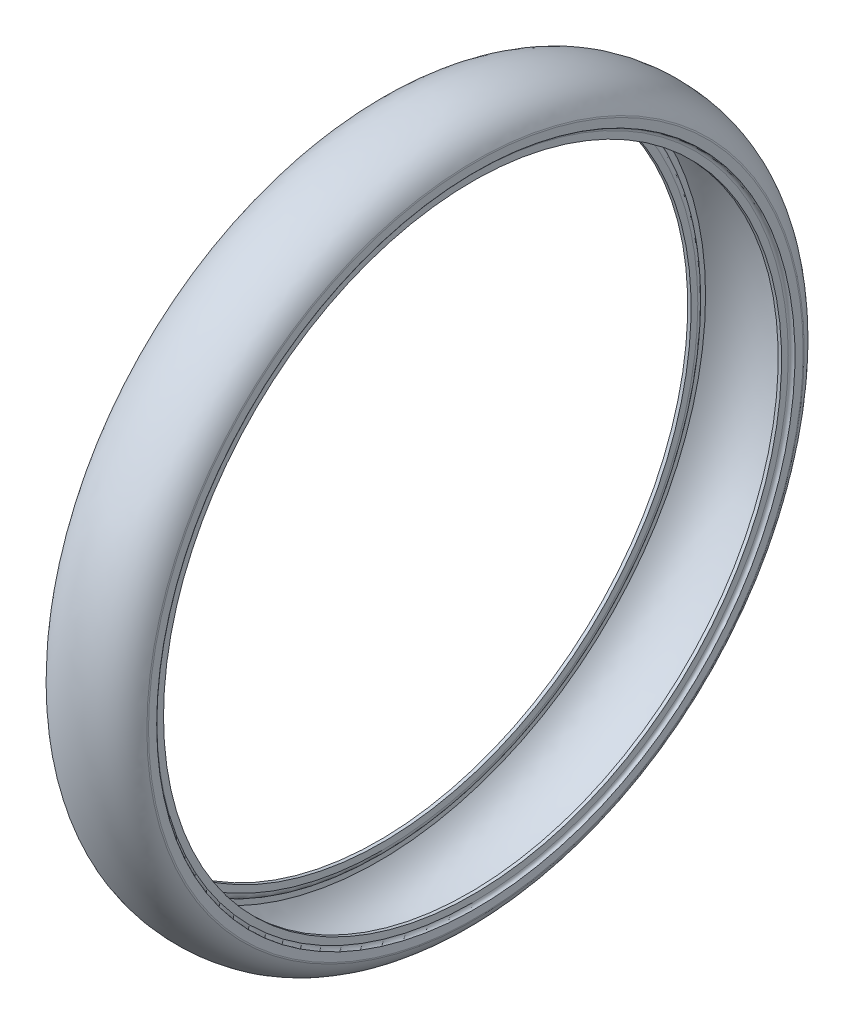
ISO-10303-21;
HEADER;
FILE_DESCRIPTION(('STEP AP214'),'2;1');
FILE_NAME('part.step','',(''),(''),'','','');
FILE_SCHEMA(('AUTOMOTIVE_DESIGN { 1 0 10303 214 1 1 1 1 }'));
ENDSEC;
DATA;
#1=APPLICATION_CONTEXT('core data for automotive mechanical design processes');
#2=APPLICATION_PROTOCOL_DEFINITION('international standard','automotive_design',2000,#1);
#3=PRODUCT_CONTEXT('',#1,'mechanical');
#4=PRODUCT('Part','Part','',(#3));
#5=PRODUCT_RELATED_PRODUCT_CATEGORY('part','',(#4));
#6=PRODUCT_DEFINITION_FORMATION('','',#4);
#7=PRODUCT_DEFINITION_CONTEXT('part definition',#1,'design');
#8=PRODUCT_DEFINITION('design','',#6,#7);
#9=PRODUCT_DEFINITION_SHAPE('','',#8);
#10=(LENGTH_UNIT() NAMED_UNIT(*) SI_UNIT(.MILLI.,.METRE.));
#11=(NAMED_UNIT(*) PLANE_ANGLE_UNIT() SI_UNIT($,.RADIAN.));
#12=(NAMED_UNIT(*) SI_UNIT($,.STERADIAN.) SOLID_ANGLE_UNIT());
#13=UNCERTAINTY_MEASURE_WITH_UNIT(LENGTH_MEASURE(1.E-05),#10,'distance_accuracy_value','');
#14=(GEOMETRIC_REPRESENTATION_CONTEXT(3) GLOBAL_UNCERTAINTY_ASSIGNED_CONTEXT((#13)) GLOBAL_UNIT_ASSIGNED_CONTEXT((#10,
#11,#12)) REPRESENTATION_CONTEXT('',''));
#15=CARTESIAN_POINT('',(0.,0.,0.));
#16=DIRECTION('',(0.,0.,1.));
#17=DIRECTION('',(1.,0.,0.));
#18=AXIS2_PLACEMENT_3D('',#15,#16,#17);
#19=CARTESIAN_POINT('',(-69.7003218060119,0.,0.));
#20=DIRECTION('',(-1.,0.,0.));
#21=DIRECTION('',(0.,0.,1.));
#22=AXIS2_PLACEMENT_3D('',#19,#20,#21);
#23=CYLINDRICAL_SURFACE('',#22,190.453309168517);
#24=CARTESIAN_POINT('',(29.9221511893584,0.,0.));
#25=DIRECTION('',(-1.,0.,0.));
#26=DIRECTION('',(0.,0.,1.));
#27=AXIS2_PLACEMENT_3D('',#24,#25,#26);
#28=CIRCLE('',#27,190.453309168517);
#29=CARTESIAN_POINT('',(29.9221511893584,0.,190.453309168517));
#30=VERTEX_POINT('',#29);
#31=EDGE_CURVE('E10',#30,#30,#28,.T.);
#32=ORIENTED_EDGE('',*,*,#31,.F.);
#33=EDGE_LOOP('',(#32));
#34=FACE_BOUND('',#33,.T.);
#35=CARTESIAN_POINT('',(29.9973296976846,0.,0.));
#36=DIRECTION('',(-1.,0.,0.));
#37=DIRECTION('',(0.,0.,1.));
#38=AXIS2_PLACEMENT_3D('',#35,#36,#37);
#39=CIRCLE('',#38,190.453309168517);
#40=CARTESIAN_POINT('',(29.9973296976846,0.,190.453309168517));
#41=VERTEX_POINT('',#40);
#42=EDGE_CURVE('E97',#41,#41,#39,.T.);
#43=ORIENTED_EDGE('',*,*,#42,.T.);
#44=EDGE_LOOP('',(#43));
#45=FACE_BOUND('',#44,.T.);
#46=ADVANCED_FACE('F33',(#34,#45),#23,.T.);
#47=CARTESIAN_POINT('',(29.9221511893584,0.,0.));
#48=DIRECTION('',(1.,0.,0.));
#49=DIRECTION('',(0.,0.,-1.));
#50=AXIS2_PLACEMENT_3D('',#47,#48,#49);
#51=CONICAL_SURFACE('',#50,190.453309168517,1.56326504380723);
#52=CARTESIAN_POINT('',(29.9592376138256,0.,0.));
#53=DIRECTION('',(-1.,0.,0.));
#54=DIRECTION('',(0.,0.,1.));
#55=AXIS2_PLACEMENT_3D('',#52,#53,#54);
#56=CIRCLE('',#55,195.377533014812);
#57=CARTESIAN_POINT('',(29.9592376138256,0.,195.377533014812));
#58=VERTEX_POINT('',#57);
#59=EDGE_CURVE('E39',#58,#58,#56,.T.);
#60=ORIENTED_EDGE('',*,*,#59,.F.);
#61=EDGE_LOOP('',(#60));
#62=FACE_BOUND('',#61,.T.);
#63=ORIENTED_EDGE('',*,*,#31,.T.);
#64=EDGE_LOOP('',(#63));
#65=FACE_BOUND('',#64,.T.);
#66=ADVANCED_FACE('F160',(#62,#65),#51,.F.);
#67=CARTESIAN_POINT('',(27.9592943337809,0.,0.));
#68=DIRECTION('',(-1.,0.,0.));
#69=DIRECTION('',(0.,0.,1.));
#70=AXIS2_PLACEMENT_3D('',#67,#68,#69);
#71=TOROIDAL_SURFACE('',#70,195.392595438395,2.);
#72=CARTESIAN_POINT('',(29.7951588128677,0.,0.));
#73=DIRECTION('',(-1.,0.,0.));
#74=DIRECTION('',(0.,0.,1.));
#75=AXIS2_PLACEMENT_3D('',#72,#73,#74);
#76=CIRCLE('',#75,196.186069832706);
#77=CARTESIAN_POINT('',(29.7951588128677,0.,196.186069832706));
#78=VERTEX_POINT('',#77);
#79=EDGE_CURVE('E43',#78,#78,#76,.T.);
#80=ORIENTED_EDGE('',*,*,#79,.F.);
#81=EDGE_LOOP('',(#80));
#82=FACE_BOUND('',#81,.T.);
#83=ORIENTED_EDGE('',*,*,#59,.T.);
#84=EDGE_LOOP('',(#83));
#85=FACE_BOUND('',#84,.T.);
#86=ADVANCED_FACE('F157',(#82,#85),#71,.T.);
#87=CARTESIAN_POINT('',(29.7951588128678,196.186069832706,0.));
#88=CARTESIAN_POINT('',(24.6514982379357,208.086975280572,0.));
#89=CARTESIAN_POINT('',(-1.31981855837392,214.356733350278,0.));
#90=CARTESIAN_POINT('',(-21.5303275099972,207.553282450587,0.));
#91=CARTESIAN_POINT('',(-29.5569901405227,196.163244360254,0.));
#92=B_SPLINE_CURVE_WITH_KNOTS('',3,(#87,#88,#89,#90,#91),.UNSPECIFIED.,.F.,.F.,(4,1,4),
(0.00865375810494037,0.498923348823319,0.989683095372889),.UNSPECIFIED.);
#93=CARTESIAN_POINT('',(-69.7003218060119,0.,0.));
#94=DIRECTION('',(-1.,0.,0.));
#95=AXIS1_PLACEMENT('',#93,#94);
#96=SURFACE_OF_REVOLUTION('',#92,#95);
#97=CARTESIAN_POINT('',(-29.5569901405227,0.,0.));
#98=DIRECTION('',(-1.,0.,0.));
#99=DIRECTION('',(0.,0.,1.));
#100=AXIS2_PLACEMENT_3D('',#97,#98,#99);
#101=CIRCLE('',#100,196.163244360254);
#102=CARTESIAN_POINT('',(-29.5569901405227,0.,196.163244360254));
#103=VERTEX_POINT('',#102);
#104=EDGE_CURVE('E47',#103,#103,#101,.T.);
#105=ORIENTED_EDGE('',*,*,#104,.F.);
#106=EDGE_LOOP('',(#105));
#107=FACE_BOUND('',#106,.T.);
#108=ORIENTED_EDGE('',*,*,#79,.T.);
#109=EDGE_LOOP('',(#108));
#110=FACE_BOUND('',#109,.T.);
#111=ADVANCED_FACE('F153',(#107,#110),#96,.T.);
#112=CARTESIAN_POINT('',(-27.9221511893584,0.,0.));
#113=DIRECTION('',(-1.,0.,0.));
#114=DIRECTION('',(0.,0.,1.));
#115=AXIS2_PLACEMENT_3D('',#112,#113,#114);
#116=TOROIDAL_SURFACE('',#115,195.011158597928,1.99999999999999);
#117=CARTESIAN_POINT('',(-29.9221511893584,0.,0.));
#118=DIRECTION('',(-1.,0.,0.));
#119=DIRECTION('',(0.,0.,1.));
#120=AXIS2_PLACEMENT_3D('',#117,#118,#119);
#121=CIRCLE('',#120,195.011158597928);
#122=CARTESIAN_POINT('',(-29.9221511893584,0.,195.011158597928));
#123=VERTEX_POINT('',#122);
#124=EDGE_CURVE('E52',#123,#123,#121,.T.);
#125=ORIENTED_EDGE('',*,*,#124,.F.);
#126=EDGE_LOOP('',(#125));
#127=FACE_BOUND('',#126,.T.);
#128=ORIENTED_EDGE('',*,*,#104,.T.);
#129=EDGE_LOOP('',(#128));
#130=FACE_BOUND('',#129,.T.);
#131=ADVANCED_FACE('F149',(#127,#130),#116,.T.);
#132=CARTESIAN_POINT('',(-29.9221511893584,190.453309168517,0.));
#133=DIRECTION('',(1.,0.,0.));
#134=DIRECTION('',(0.,0.,-1.));
#135=AXIS2_PLACEMENT_3D('',#132,#133,#134);
#136=PLANE('',#135);
#137=CARTESIAN_POINT('',(-29.9221511893584,0.,0.));
#138=DIRECTION('',(-1.,0.,0.));
#139=DIRECTION('',(0.,0.,1.));
#140=AXIS2_PLACEMENT_3D('',#137,#138,#139);
#141=CIRCLE('',#140,190.453309168517);
#142=CARTESIAN_POINT('',(-29.9221511893584,0.,190.453309168517));
#143=VERTEX_POINT('',#142);
#144=EDGE_CURVE('E55',#143,#143,#141,.T.);
#145=ORIENTED_EDGE('',*,*,#144,.F.);
#146=EDGE_LOOP('',(#145));
#147=FACE_BOUND('',#146,.T.);
#148=ORIENTED_EDGE('',*,*,#124,.T.);
#149=EDGE_LOOP('',(#148));
#150=FACE_BOUND('',#149,.T.);
#151=ADVANCED_FACE('F145',(#147,#150),#136,.F.);
#152=CARTESIAN_POINT('',(-69.7003218060119,0.,0.));
#153=DIRECTION('',(-1.,0.,0.));
#154=DIRECTION('',(0.,0.,1.));
#155=AXIS2_PLACEMENT_3D('',#152,#153,#154);
#156=CYLINDRICAL_SURFACE('',#155,190.453309168517);
#157=CARTESIAN_POINT('',(-29.9973296976846,0.,0.));
#158=DIRECTION('',(-1.,0.,0.));
#159=DIRECTION('',(0.,0.,1.));
#160=AXIS2_PLACEMENT_3D('',#157,#158,#159);
#161=CIRCLE('',#160,190.453309168517);
#162=CARTESIAN_POINT('',(-29.9973296976846,0.,190.453309168517));
#163=VERTEX_POINT('',#162);
#164=EDGE_CURVE('E58',#163,#163,#161,.T.);
#165=ORIENTED_EDGE('',*,*,#164,.F.);
#166=EDGE_LOOP('',(#165));
#167=FACE_BOUND('',#166,.T.);
#168=ORIENTED_EDGE('',*,*,#144,.T.);
#169=EDGE_LOOP('',(#168));
#170=FACE_BOUND('',#169,.T.);
#171=ADVANCED_FACE('F141',(#167,#170),#156,.T.);
#172=CARTESIAN_POINT('',(-29.9973296976845,0.,0.));
#173=DIRECTION('',(-1.,0.,0.));
#174=DIRECTION('',(0.,0.,1.));
#175=AXIS2_PLACEMENT_3D('',#172,#173,#174);
#176=TOROIDAL_SURFACE('',#175,188.453309168517,2.);
#177=CARTESIAN_POINT('',(-27.9973296976845,0.,0.));
#178=DIRECTION('',(-1.,0.,0.));
#179=DIRECTION('',(0.,0.,1.));
#180=AXIS2_PLACEMENT_3D('',#177,#178,#179);
#181=CIRCLE('',#180,188.453309168517);
#182=CARTESIAN_POINT('',(-27.9973296976845,0.,188.453309168517));
#183=VERTEX_POINT('',#182);
#184=EDGE_CURVE('E61',#183,#183,#181,.T.);
#185=ORIENTED_EDGE('',*,*,#184,.F.);
#186=EDGE_LOOP('',(#185));
#187=FACE_BOUND('',#186,.T.);
#188=ORIENTED_EDGE('',*,*,#164,.T.);
#189=EDGE_LOOP('',(#188));
#190=FACE_BOUND('',#189,.T.);
#191=ADVANCED_FACE('F137',(#187,#190),#176,.F.);
#192=CARTESIAN_POINT('',(-27.9973296976845,184.453309168517,0.));
#193=DIRECTION('',(1.,0.,0.));
#194=DIRECTION('',(0.,0.,-1.));
#195=AXIS2_PLACEMENT_3D('',#192,#193,#194);
#196=PLANE('',#195);
#197=CARTESIAN_POINT('',(-27.9973296976845,0.,0.));
#198=DIRECTION('',(-1.,0.,0.));
#199=DIRECTION('',(0.,0.,1.));
#200=AXIS2_PLACEMENT_3D('',#197,#198,#199);
#201=CIRCLE('',#200,184.453309168517);
#202=CARTESIAN_POINT('',(-27.9973296976845,0.,184.453309168517));
#203=VERTEX_POINT('',#202);
#204=EDGE_CURVE('E64',#203,#203,#201,.T.);
#205=ORIENTED_EDGE('',*,*,#204,.F.);
#206=EDGE_LOOP('',(#205));
#207=FACE_BOUND('',#206,.T.);
#208=ORIENTED_EDGE('',*,*,#184,.T.);
#209=EDGE_LOOP('',(#208));
#210=FACE_BOUND('',#209,.T.);
#211=ADVANCED_FACE('F133',(#207,#210),#196,.F.);
#212=CARTESIAN_POINT('',(-69.7003218060119,0.,0.));
#213=DIRECTION('',(-1.,0.,0.));
#214=DIRECTION('',(0.,0.,1.));
#215=AXIS2_PLACEMENT_3D('',#212,#213,#214);
#216=CYLINDRICAL_SURFACE('',#215,184.453309168517);
#217=CARTESIAN_POINT('',(-25.9973296976845,0.,0.));
#218=DIRECTION('',(-1.,0.,0.));
#219=DIRECTION('',(0.,0.,1.));
#220=AXIS2_PLACEMENT_3D('',#217,#218,#219);
#221=CIRCLE('',#220,184.453309168517);
#222=CARTESIAN_POINT('',(-25.9973296976845,0.,184.453309168517));
#223=VERTEX_POINT('',#222);
#224=EDGE_CURVE('E67',#223,#223,#221,.T.);
#225=ORIENTED_EDGE('',*,*,#224,.F.);
#226=EDGE_LOOP('',(#225));
#227=FACE_BOUND('',#226,.T.);
#228=ORIENTED_EDGE('',*,*,#204,.T.);
#229=EDGE_LOOP('',(#228));
#230=FACE_BOUND('',#229,.T.);
#231=ADVANCED_FACE('F129',(#227,#230),#216,.F.);
#232=CARTESIAN_POINT('',(-25.9973296976845,184.453309168517,0.));
#233=DIRECTION('',(-1.,0.,0.));
#234=DIRECTION('',(0.,0.,1.));
#235=AXIS2_PLACEMENT_3D('',#232,#233,#234);
#236=PLANE('',#235);
#237=CARTESIAN_POINT('',(-25.9973296976845,0.,0.));
#238=DIRECTION('',(-1.,0.,0.));
#239=DIRECTION('',(0.,0.,1.));
#240=AXIS2_PLACEMENT_3D('',#237,#238,#239);
#241=CIRCLE('',#240,188.453309168517);
#242=CARTESIAN_POINT('',(-25.9973296976845,0.,188.453309168517));
#243=VERTEX_POINT('',#242);
#244=EDGE_CURVE('E70',#243,#243,#241,.T.);
#245=ORIENTED_EDGE('',*,*,#244,.F.);
#246=EDGE_LOOP('',(#245));
#247=FACE_BOUND('',#246,.T.);
#248=ORIENTED_EDGE('',*,*,#224,.T.);
#249=EDGE_LOOP('',(#248));
#250=FACE_BOUND('',#249,.T.);
#251=ADVANCED_FACE('F125',(#247,#250),#236,.F.);
#252=CARTESIAN_POINT('',(-29.9973296976845,0.,0.));
#253=DIRECTION('',(-1.,0.,0.));
#254=DIRECTION('',(0.,0.,1.));
#255=AXIS2_PLACEMENT_3D('',#252,#253,#254);
#256=TOROIDAL_SURFACE('',#255,188.453309168517,4.);
#257=CARTESIAN_POINT('',(-27.9221511893584,0.,0.));
#258=DIRECTION('',(-1.,0.,0.));
#259=DIRECTION('',(0.,0.,1.));
#260=AXIS2_PLACEMENT_3D('',#257,#258,#259);
#261=CIRCLE('',#260,191.872904781829);
#262=CARTESIAN_POINT('',(-27.9221511893584,0.,191.872904781829));
#263=VERTEX_POINT('',#262);
#264=EDGE_CURVE('E73',#263,#263,#261,.T.);
#265=ORIENTED_EDGE('',*,*,#264,.F.);
#266=EDGE_LOOP('',(#265));
#267=FACE_BOUND('',#266,.T.);
#268=ORIENTED_EDGE('',*,*,#244,.T.);
#269=EDGE_LOOP('',(#268));
#270=FACE_BOUND('',#269,.T.);
#271=ADVANCED_FACE('F121',(#267,#270),#256,.T.);
#272=CARTESIAN_POINT('',(-27.9221511893584,191.872904781829,0.));
#273=DIRECTION('',(-1.,0.,0.));
#274=DIRECTION('',(0.,0.,1.));
#275=AXIS2_PLACEMENT_3D('',#272,#273,#274);
#276=PLANE('',#275);
#277=CARTESIAN_POINT('',(-27.9221511893584,0.,0.));
#278=DIRECTION('',(-1.,0.,0.));
#279=DIRECTION('',(0.,0.,1.));
#280=AXIS2_PLACEMENT_3D('',#277,#278,#279);
#281=CIRCLE('',#280,195.011158597928);
#282=CARTESIAN_POINT('',(-27.9221511893584,0.,195.011158597928));
#283=VERTEX_POINT('',#282);
#284=EDGE_CURVE('E76',#283,#283,#281,.T.);
#285=ORIENTED_EDGE('',*,*,#284,.F.);
#286=EDGE_LOOP('',(#285));
#287=FACE_BOUND('',#286,.T.);
#288=ORIENTED_EDGE('',*,*,#264,.T.);
#289=EDGE_LOOP('',(#288));
#290=FACE_BOUND('',#289,.T.);
#291=ADVANCED_FACE('F116',(#287,#290),#276,.F.);
#292=CARTESIAN_POINT('',(-27.9221511893586,195.011158597927,0.));
#293=CARTESIAN_POINT('',(-27.6854153129936,195.347092817822,0.));
#294=CARTESIAN_POINT('',(-27.1978906081691,196.018474920942,0.));
#295=CARTESIAN_POINT('',(-26.2212226379407,197.283543915831,0.));
#296=CARTESIAN_POINT('',(-24.9727395917876,198.757340925888,0.));
#297=CARTESIAN_POINT('',(-23.4391781737674,200.351334900411,0.));
#298=CARTESIAN_POINT('',(-21.3450815696214,202.259647180787,0.));
#299=CARTESIAN_POINT('',(-18.6362606582634,204.258701964174,0.));
#300=CARTESIAN_POINT('',(-15.2325942384471,206.109100247002,0.));
#301=CARTESIAN_POINT('',(-11.6626280863641,207.47227903724,0.));
#302=CARTESIAN_POINT('',(-6.67180156296508,208.710119894907,0.));
#303=CARTESIAN_POINT('',(0.0429465905163158,209.286544548283,0.));
#304=CARTESIAN_POINT('',(8.67103005462347,208.789989674768,0.));
#305=CARTESIAN_POINT('',(15.4436230361682,207.004500137463,0.));
#306=CARTESIAN_POINT('',(20.1946017281043,204.565969407404,0.));
#307=CARTESIAN_POINT('',(23.3322732445764,202.192241493079,0.));
#308=CARTESIAN_POINT('',(25.5394324697308,199.700965981685,0.));
#309=CARTESIAN_POINT('',(27.0188047463973,197.376242978578,0.));
#310=CARTESIAN_POINT('',(27.6724214497826,196.056334232642,0.));
#311=CARTESIAN_POINT('',(27.9592943337809,195.392595438395,0.));
#312=B_SPLINE_CURVE_WITH_KNOTS('',3,(#292,#293,#294,#295,#296,#297,#298,#299,#300,#301,#302,
#303,#304,#305,#306,#307,#308,#309,#310,#311),.UNSPECIFIED.,.F.,.F.,(4,1,1,1,1,1,1,1,1,1,1,1,1,
1,1,1,1,4),(0.00865375810494037,0.0239823414997521,0.0393109248945638,0.0699680916841871,
0.100625258473811,0.131282425263434,0.192596758842681,0.253911092421927,0.315225426001174,
0.376539759580421,0.499168426738915,0.621797093897408,0.744425761055902,0.805740094635149,
0.867054428214395,0.928368761793642,0.959025928583265,0.989683095372889),.UNSPECIFIED.);
#313=CARTESIAN_POINT('',(-69.7003218060119,0.,0.));
#314=DIRECTION('',(-1.,0.,0.));
#315=AXIS1_PLACEMENT('',#313,#314);
#316=SURFACE_OF_REVOLUTION('',#312,#315);
#317=CARTESIAN_POINT('',(27.9592943337809,0.,0.));
#318=DIRECTION('',(-1.,0.,0.));
#319=DIRECTION('',(0.,0.,1.));
#320=AXIS2_PLACEMENT_3D('',#317,#318,#319);
#321=CIRCLE('',#320,195.392595438395);
#322=CARTESIAN_POINT('',(27.9592943337809,0.,195.392595438395));
#323=VERTEX_POINT('',#322);
#324=EDGE_CURVE('E79',#323,#323,#321,.T.);
#325=ORIENTED_EDGE('',*,*,#324,.F.);
#326=EDGE_LOOP('',(#325));
#327=FACE_BOUND('',#326,.T.);
#328=ORIENTED_EDGE('',*,*,#284,.T.);
#329=EDGE_LOOP('',(#328));
#330=FACE_BOUND('',#329,.T.);
#331=ADVANCED_FACE('F111',(#327,#330),#316,.T.);
#332=CARTESIAN_POINT('',(27.9592943337809,0.,0.));
#333=DIRECTION('',(1.,0.,0.));
#334=DIRECTION('',(0.,0.,-1.));
#335=AXIS2_PLACEMENT_3D('',#332,#333,#334);
#336=CONICAL_SURFACE('',#335,195.392595438395,1.56326504380723);
#337=CARTESIAN_POINT('',(27.9328347029213,0.,0.));
#338=DIRECTION('',(-1.,0.,0.));
#339=DIRECTION('',(0.,0.,1.));
#340=AXIS2_PLACEMENT_3D('',#337,#338,#339);
#341=CIRCLE('',#340,191.879365270888);
#342=CARTESIAN_POINT('',(27.9328347029213,0.,191.879365270888));
#343=VERTEX_POINT('',#342);
#344=EDGE_CURVE('E82',#343,#343,#341,.T.);
#345=ORIENTED_EDGE('',*,*,#344,.F.);
#346=EDGE_LOOP('',(#345));
#347=FACE_BOUND('',#346,.T.);
#348=ORIENTED_EDGE('',*,*,#324,.T.);
#349=EDGE_LOOP('',(#348));
#350=FACE_BOUND('',#349,.T.);
#351=ADVANCED_FACE('F115',(#347,#350),#336,.T.);
#352=CARTESIAN_POINT('',(29.9973296976845,0.,0.));
#353=DIRECTION('',(-1.,0.,0.));
#354=DIRECTION('',(0.,0.,1.));
#355=AXIS2_PLACEMENT_3D('',#352,#353,#354);
#356=TOROIDAL_SURFACE('',#355,188.453309168517,4.);
#357=CARTESIAN_POINT('',(25.9973296976845,0.,0.));
#358=DIRECTION('',(-1.,0.,0.));
#359=DIRECTION('',(0.,0.,1.));
#360=AXIS2_PLACEMENT_3D('',#357,#358,#359);
#361=CIRCLE('',#360,188.453309168517);
#362=CARTESIAN_POINT('',(25.9973296976845,0.,188.453309168517));
#363=VERTEX_POINT('',#362);
#364=EDGE_CURVE('E85',#363,#363,#361,.T.);
#365=ORIENTED_EDGE('',*,*,#364,.F.);
#366=EDGE_LOOP('',(#365));
#367=FACE_BOUND('',#366,.T.);
#368=ORIENTED_EDGE('',*,*,#344,.T.);
#369=EDGE_LOOP('',(#368));
#370=FACE_BOUND('',#369,.T.);
#371=ADVANCED_FACE('F194',(#367,#370),#356,.T.);
#372=CARTESIAN_POINT('',(25.9973296976845,184.453309168517,0.));
#373=DIRECTION('',(1.,0.,0.));
#374=DIRECTION('',(0.,0.,-1.));
#375=AXIS2_PLACEMENT_3D('',#372,#373,#374);
#376=PLANE('',#375);
#377=CARTESIAN_POINT('',(25.9973296976845,0.,0.));
#378=DIRECTION('',(-1.,0.,0.));
#379=DIRECTION('',(0.,0.,1.));
#380=AXIS2_PLACEMENT_3D('',#377,#378,#379);
#381=CIRCLE('',#380,184.453309168517);
#382=CARTESIAN_POINT('',(25.9973296976845,0.,184.453309168517));
#383=VERTEX_POINT('',#382);
#384=EDGE_CURVE('E88',#383,#383,#381,.T.);
#385=ORIENTED_EDGE('',*,*,#384,.F.);
#386=EDGE_LOOP('',(#385));
#387=FACE_BOUND('',#386,.T.);
#388=ORIENTED_EDGE('',*,*,#364,.T.);
#389=EDGE_LOOP('',(#388));
#390=FACE_BOUND('',#389,.T.);
#391=ADVANCED_FACE('F188',(#387,#390),#376,.F.);
#392=CARTESIAN_POINT('',(-69.7003218060119,0.,0.));
#393=DIRECTION('',(-1.,0.,0.));
#394=DIRECTION('',(0.,0.,1.));
#395=AXIS2_PLACEMENT_3D('',#392,#393,#394);
#396=CYLINDRICAL_SURFACE('',#395,184.453309168517);
#397=CARTESIAN_POINT('',(27.9973296976845,0.,0.));
#398=DIRECTION('',(-1.,0.,0.));
#399=DIRECTION('',(0.,0.,1.));
#400=AXIS2_PLACEMENT_3D('',#397,#398,#399);
#401=CIRCLE('',#400,184.453309168517);
#402=CARTESIAN_POINT('',(27.9973296976845,0.,184.453309168517));
#403=VERTEX_POINT('',#402);
#404=EDGE_CURVE('E91',#403,#403,#401,.T.);
#405=ORIENTED_EDGE('',*,*,#404,.F.);
#406=EDGE_LOOP('',(#405));
#407=FACE_BOUND('',#406,.T.);
#408=ORIENTED_EDGE('',*,*,#384,.T.);
#409=EDGE_LOOP('',(#408));
#410=FACE_BOUND('',#409,.T.);
#411=ADVANCED_FACE('F182',(#407,#410),#396,.F.);
#412=CARTESIAN_POINT('',(27.9973296976845,184.453309168517,0.));
#413=DIRECTION('',(-1.,0.,0.));
#414=DIRECTION('',(0.,0.,1.));
#415=AXIS2_PLACEMENT_3D('',#412,#413,#414);
#416=PLANE('',#415);
#417=CARTESIAN_POINT('',(27.9973296976845,0.,0.));
#418=DIRECTION('',(-1.,0.,0.));
#419=DIRECTION('',(0.,0.,1.));
#420=AXIS2_PLACEMENT_3D('',#417,#418,#419);
#421=CIRCLE('',#420,188.453309168517);
#422=CARTESIAN_POINT('',(27.9973296976845,0.,188.453309168517));
#423=VERTEX_POINT('',#422);
#424=EDGE_CURVE('E94',#423,#423,#421,.T.);
#425=ORIENTED_EDGE('',*,*,#424,.F.);
#426=EDGE_LOOP('',(#425));
#427=FACE_BOUND('',#426,.T.);
#428=ORIENTED_EDGE('',*,*,#404,.T.);
#429=EDGE_LOOP('',(#428));
#430=FACE_BOUND('',#429,.T.);
#431=ADVANCED_FACE('F176',(#427,#430),#416,.F.);
#432=CARTESIAN_POINT('',(29.9973296976845,0.,0.));
#433=DIRECTION('',(-1.,0.,0.));
#434=DIRECTION('',(0.,0.,1.));
#435=AXIS2_PLACEMENT_3D('',#432,#433,#434);
#436=TOROIDAL_SURFACE('',#435,188.453309168517,2.);
#437=ORIENTED_EDGE('',*,*,#42,.F.);
#438=EDGE_LOOP('',(#437));
#439=FACE_BOUND('',#438,.T.);
#440=ORIENTED_EDGE('',*,*,#424,.T.);
#441=EDGE_LOOP('',(#440));
#442=FACE_BOUND('',#441,.T.);
#443=ADVANCED_FACE('F173',(#439,#442),#436,.F.);
#444=CLOSED_SHELL('',(#46,#66,#86,#111,#131,#151,#171,#191,#211,#231,#251,#271,#291,#331,#351,
#371,#391,#411,#431,#443));
#445=MANIFOLD_SOLID_BREP('B2',#444);
#446=ADVANCED_BREP_SHAPE_REPRESENTATION('',(#18,#445),#14);
#447=SHAPE_DEFINITION_REPRESENTATION(#9,#446);
ENDSEC;
END-ISO-10303-21;
